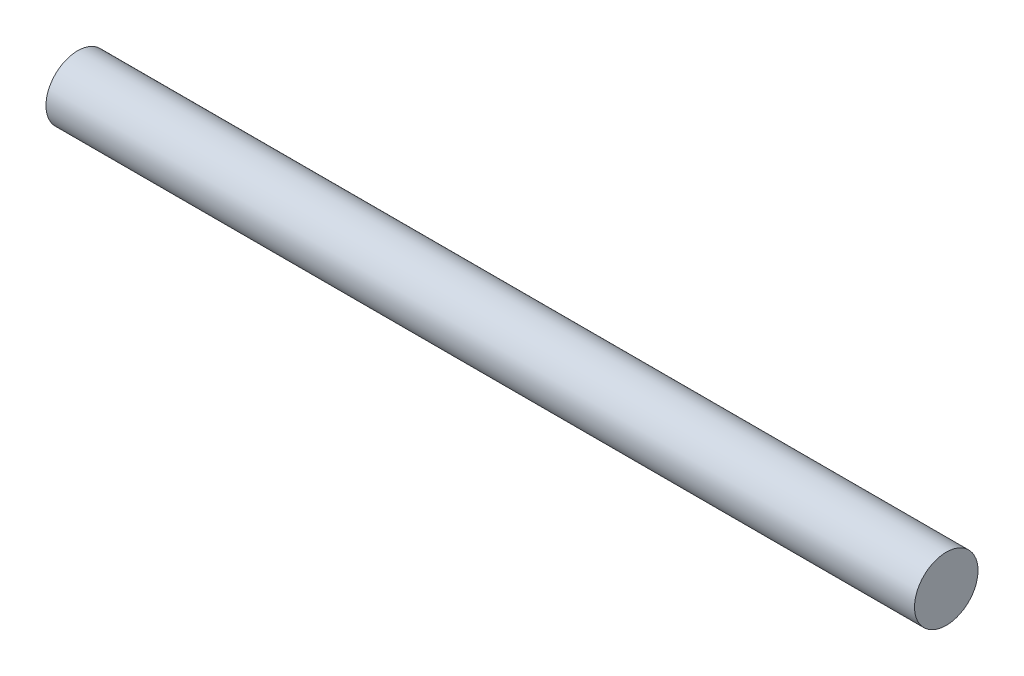
ISO-10303-21;
HEADER;
FILE_DESCRIPTION(('STEP AP214'),'2;1');
FILE_NAME('part.step','',(''),(''),'','','');
FILE_SCHEMA(('AUTOMOTIVE_DESIGN { 1 0 10303 214 1 1 1 1 }'));
ENDSEC;
DATA;
#1=APPLICATION_CONTEXT('core data for automotive mechanical design processes');
#2=APPLICATION_PROTOCOL_DEFINITION('international standard','automotive_design',2000,#1);
#3=PRODUCT_CONTEXT('',#1,'mechanical');
#4=PRODUCT('Part','Part','',(#3));
#5=PRODUCT_RELATED_PRODUCT_CATEGORY('part','',(#4));
#6=PRODUCT_DEFINITION_FORMATION('','',#4);
#7=PRODUCT_DEFINITION_CONTEXT('part definition',#1,'design');
#8=PRODUCT_DEFINITION('design','',#6,#7);
#9=PRODUCT_DEFINITION_SHAPE('','',#8);
#10=(LENGTH_UNIT() NAMED_UNIT(*) SI_UNIT(.MILLI.,.METRE.));
#11=(NAMED_UNIT(*) PLANE_ANGLE_UNIT() SI_UNIT($,.RADIAN.));
#12=(NAMED_UNIT(*) SI_UNIT($,.STERADIAN.) SOLID_ANGLE_UNIT());
#13=UNCERTAINTY_MEASURE_WITH_UNIT(LENGTH_MEASURE(1.E-05),#10,'distance_accuracy_value','');
#14=(GEOMETRIC_REPRESENTATION_CONTEXT(3) GLOBAL_UNCERTAINTY_ASSIGNED_CONTEXT((#13)) GLOBAL_UNIT_ASSIGNED_CONTEXT((#10,
#11,#12)) REPRESENTATION_CONTEXT('',''));
#15=CARTESIAN_POINT('',(0.,0.,0.));
#16=DIRECTION('',(0.,0.,1.));
#17=DIRECTION('',(1.,0.,0.));
#18=AXIS2_PLACEMENT_3D('',#15,#16,#17);
#19=CARTESIAN_POINT('',(304.,0.,0.));
#20=DIRECTION('',(-1.,0.,0.));
#21=DIRECTION('',(0.,0.,1.));
#22=AXIS2_PLACEMENT_3D('',#19,#20,#21);
#23=CYLINDRICAL_SURFACE('',#22,11.11);
#24=CARTESIAN_POINT('',(304.,0.,0.));
#25=DIRECTION('',(1.,0.,0.));
#26=DIRECTION('',(0.,0.,-1.));
#27=AXIS2_PLACEMENT_3D('',#24,#25,#26);
#28=CIRCLE('',#27,11.11);
#29=CARTESIAN_POINT('',(304.,0.,-11.11));
#30=VERTEX_POINT('',#29);
#31=EDGE_CURVE('E11',#30,#30,#28,.T.);
#32=ORIENTED_EDGE('',*,*,#31,.F.);
#33=EDGE_LOOP('',(#32));
#34=FACE_BOUND('',#33,.T.);
#35=CARTESIAN_POINT('',(0.,0.,0.));
#36=DIRECTION('',(1.,0.,0.));
#37=DIRECTION('',(0.,0.,-1.));
#38=AXIS2_PLACEMENT_3D('',#35,#36,#37);
#39=CIRCLE('',#38,11.11);
#40=CARTESIAN_POINT('',(0.,0.,-11.11));
#41=VERTEX_POINT('',#40);
#42=EDGE_CURVE('E40',#41,#41,#39,.T.);
#43=ORIENTED_EDGE('',*,*,#42,.T.);
#44=EDGE_LOOP('',(#43));
#45=FACE_BOUND('',#44,.T.);
#46=ADVANCED_FACE('F37',(#34,#45),#23,.T.);
#47=CARTESIAN_POINT('',(304.,0.,0.));
#48=DIRECTION('',(1.,0.,0.));
#49=DIRECTION('',(0.,0.,-1.));
#50=AXIS2_PLACEMENT_3D('',#47,#48,#49);
#51=PLANE('',#50);
#52=ORIENTED_EDGE('',*,*,#31,.T.);
#53=EDGE_LOOP('',(#52));
#54=FACE_BOUND('',#53,.T.);
#55=ADVANCED_FACE('F66',(#54),#51,.T.);
#56=CARTESIAN_POINT('',(0.,0.,0.));
#57=DIRECTION('',(1.,0.,0.));
#58=DIRECTION('',(0.,0.,-1.));
#59=AXIS2_PLACEMENT_3D('',#56,#57,#58);
#60=PLANE('',#59);
#61=CARTESIAN_POINT('',(0.,5.3,0.));
#62=DIRECTION('',(-1.,0.,0.));
#63=DIRECTION('',(0.,0.,1.));
#64=AXIS2_PLACEMENT_3D('',#61,#62,#63);
#65=CIRCLE('',#64,1.49999999999999);
#66=CARTESIAN_POINT('',(0.,5.3,1.49999999999999));
#67=VERTEX_POINT('',#66);
#68=EDGE_CURVE('E56',#67,#67,#65,.T.);
#69=ORIENTED_EDGE('',*,*,#68,.F.);
#70=EDGE_LOOP('',(#69));
#71=FACE_BOUND('',#70,.T.);
#72=ORIENTED_EDGE('',*,*,#42,.F.);
#73=EDGE_LOOP('',(#72));
#74=FACE_BOUND('',#73,.T.);
#75=ADVANCED_FACE('F50',(#71,#74),#60,.F.);
#76=CARTESIAN_POINT('',(11.,5.3,0.));
#77=DIRECTION('',(-1.,0.,0.));
#78=DIRECTION('',(0.,0.,1.));
#79=AXIS2_PLACEMENT_3D('',#76,#77,#78);
#80=CONICAL_SURFACE('',#79,1.5,1.02974425867665);
#81=CARTESIAN_POINT('',(11.9012909285413,5.3,0.));
#82=VERTEX_POINT('',#81);
#83=VERTEX_LOOP('',#82);
#84=FACE_BOUND('',#83,.T.);
#85=CARTESIAN_POINT('',(11.,5.3,0.));
#86=DIRECTION('',(-1.,0.,0.));
#87=DIRECTION('',(0.,0.,1.));
#88=AXIS2_PLACEMENT_3D('',#85,#86,#87);
#89=CIRCLE('',#88,1.5);
#90=CARTESIAN_POINT('',(11.,5.3,1.5));
#91=VERTEX_POINT('',#90);
#92=EDGE_CURVE('E54',#91,#91,#89,.T.);
#93=ORIENTED_EDGE('',*,*,#92,.T.);
#94=EDGE_LOOP('',(#93));
#95=FACE_BOUND('',#94,.T.);
#96=ADVANCED_FACE('F46',(#84,#95),#80,.F.);
#97=CARTESIAN_POINT('',(0.,5.3,0.));
#98=DIRECTION('',(-1.,0.,0.));
#99=DIRECTION('',(0.,0.,1.));
#100=AXIS2_PLACEMENT_3D('',#97,#98,#99);
#101=CYLINDRICAL_SURFACE('',#100,1.49999999999999);
#102=ORIENTED_EDGE('',*,*,#92,.F.);
#103=EDGE_LOOP('',(#102));
#104=FACE_BOUND('',#103,.T.);
#105=ORIENTED_EDGE('',*,*,#68,.T.);
#106=EDGE_LOOP('',(#105));
#107=FACE_BOUND('',#106,.T.);
#108=ADVANCED_FACE('F49',(#104,#107),#101,.F.);
#109=CLOSED_SHELL('',(#46,#55,#75,#96,#108));
#110=MANIFOLD_SOLID_BREP('B2',#109);
#111=ADVANCED_BREP_SHAPE_REPRESENTATION('',(#18,#110),#14);
#112=SHAPE_DEFINITION_REPRESENTATION(#9,#111);
ENDSEC;
END-ISO-10303-21;
